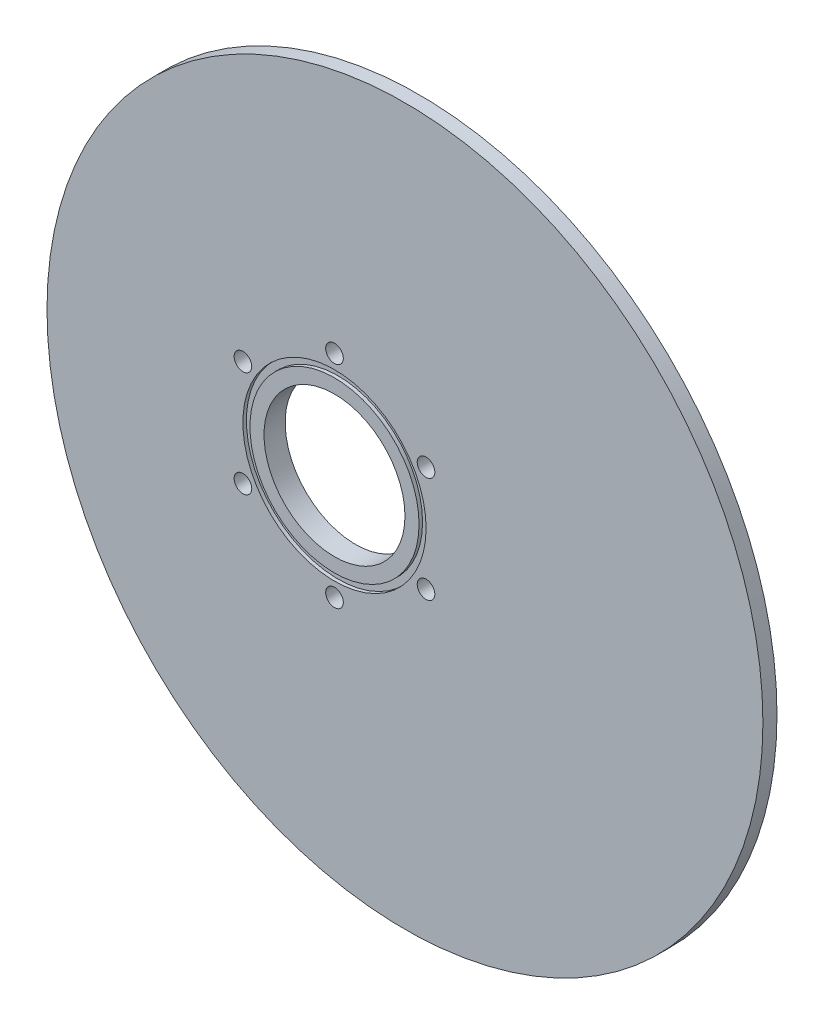
ISO-10303-21;
HEADER;
FILE_DESCRIPTION(('STEP AP214'),'2;1');
FILE_NAME('part.step','',(''),(''),'','','');
FILE_SCHEMA(('AUTOMOTIVE_DESIGN { 1 0 10303 214 1 1 1 1 }'));
ENDSEC;
DATA;
#1=APPLICATION_CONTEXT('core data for automotive mechanical design processes');
#2=APPLICATION_PROTOCOL_DEFINITION('international standard','automotive_design',2000,#1);
#3=PRODUCT_CONTEXT('',#1,'mechanical');
#4=PRODUCT('Part','Part','',(#3));
#5=PRODUCT_RELATED_PRODUCT_CATEGORY('part','',(#4));
#6=PRODUCT_DEFINITION_FORMATION('','',#4);
#7=PRODUCT_DEFINITION_CONTEXT('part definition',#1,'design');
#8=PRODUCT_DEFINITION('design','',#6,#7);
#9=PRODUCT_DEFINITION_SHAPE('','',#8);
#10=(LENGTH_UNIT() NAMED_UNIT(*) SI_UNIT(.MILLI.,.METRE.));
#11=(NAMED_UNIT(*) PLANE_ANGLE_UNIT() SI_UNIT($,.RADIAN.));
#12=(NAMED_UNIT(*) SI_UNIT($,.STERADIAN.) SOLID_ANGLE_UNIT());
#13=UNCERTAINTY_MEASURE_WITH_UNIT(LENGTH_MEASURE(1.E-05),#10,'distance_accuracy_value','');
#14=(GEOMETRIC_REPRESENTATION_CONTEXT(3) GLOBAL_UNCERTAINTY_ASSIGNED_CONTEXT((#13)) GLOBAL_UNIT_ASSIGNED_CONTEXT((#10,
#11,#12)) REPRESENTATION_CONTEXT('',''));
#15=CARTESIAN_POINT('',(0.,0.,0.));
#16=DIRECTION('',(0.,0.,1.));
#17=DIRECTION('',(1.,0.,0.));
#18=AXIS2_PLACEMENT_3D('',#15,#16,#17);
#19=CARTESIAN_POINT('',(0.,0.,0.));
#20=DIRECTION('',(0.,0.,1.));
#21=DIRECTION('',(1.,0.,0.));
#22=AXIS2_PLACEMENT_3D('',#19,#20,#21);
#23=PLANE('',#22);
#24=CARTESIAN_POINT('',(-20.,0.,0.));
#25=DIRECTION('',(0.,0.,1.));
#26=DIRECTION('',(1.,0.,0.));
#27=AXIS2_PLACEMENT_3D('',#24,#25,#26);
#28=CIRCLE('',#27,20.);
#29=CARTESIAN_POINT('',(0.,0.,0.));
#30=VERTEX_POINT('',#29);
#31=EDGE_CURVE('E51',#30,#30,#28,.T.);
#32=ORIENTED_EDGE('',*,*,#31,.F.);
#33=EDGE_LOOP('',(#32));
#34=FACE_BOUND('',#33,.T.);
#35=CARTESIAN_POINT('',(-20.,0.,0.));
#36=DIRECTION('',(0.,0.,1.));
#37=DIRECTION('',(1.,0.,0.));
#38=AXIS2_PLACEMENT_3D('',#35,#36,#37);
#39=CIRCLE('',#38,24.);
#40=CARTESIAN_POINT('',(4.,0.,0.));
#41=VERTEX_POINT('',#40);
#42=EDGE_CURVE('E99',#41,#41,#39,.T.);
#43=ORIENTED_EDGE('',*,*,#42,.T.);
#44=EDGE_LOOP('',(#43));
#45=FACE_BOUND('',#44,.T.);
#46=ADVANCED_FACE('F30',(#34,#45),#23,.T.);
#47=CARTESIAN_POINT('',(-20.,0.,0.));
#48=DIRECTION('',(0.,0.,1.));
#49=DIRECTION('',(1.,0.,0.));
#50=AXIS2_PLACEMENT_3D('',#47,#48,#49);
#51=CIRCLE('',#50,26.);
#52=CARTESIAN_POINT('',(6.,0.,0.));
#53=VERTEX_POINT('',#52);
#54=EDGE_CURVE('E93',#53,#53,#51,.T.);
#55=ORIENTED_EDGE('',*,*,#54,.F.);
#56=EDGE_LOOP('',(#55));
#57=FACE_BOUND('',#56,.T.);
#58=CARTESIAN_POINT('',(-45.980762113533,14.9999999999997,0.));
#59=DIRECTION('',(0.,0.,1.));
#60=DIRECTION('',(1.,0.,0.));
#61=AXIS2_PLACEMENT_3D('',#58,#59,#60);
#62=CIRCLE('',#61,2.49999999999999);
#63=CARTESIAN_POINT('',(-43.480762113533,14.9999999999997,0.));
#64=VERTEX_POINT('',#63);
#65=EDGE_CURVE('E87',#64,#64,#62,.T.);
#66=ORIENTED_EDGE('',*,*,#65,.F.);
#67=EDGE_LOOP('',(#66));
#68=FACE_BOUND('',#67,.T.);
#69=CARTESIAN_POINT('',(-45.9807621135326,-15.0000000000003,0.));
#70=DIRECTION('',(0.,0.,1.));
#71=DIRECTION('',(1.,0.,0.));
#72=AXIS2_PLACEMENT_3D('',#69,#70,#71);
#73=CIRCLE('',#72,2.49999999999999);
#74=CARTESIAN_POINT('',(-43.4807621135326,-15.0000000000003,0.));
#75=VERTEX_POINT('',#74);
#76=EDGE_CURVE('E81',#75,#75,#73,.T.);
#77=ORIENTED_EDGE('',*,*,#76,.F.);
#78=EDGE_LOOP('',(#77));
#79=FACE_BOUND('',#78,.T.);
#80=CARTESIAN_POINT('',(-19.9999999999993,-30.,0.));
#81=DIRECTION('',(0.,0.,1.));
#82=DIRECTION('',(1.,0.,0.));
#83=AXIS2_PLACEMENT_3D('',#80,#81,#82);
#84=CIRCLE('',#83,2.5);
#85=CARTESIAN_POINT('',(-17.4999999999993,-30.,0.));
#86=VERTEX_POINT('',#85);
#87=EDGE_CURVE('E75',#86,#86,#84,.T.);
#88=ORIENTED_EDGE('',*,*,#87,.F.);
#89=EDGE_LOOP('',(#88));
#90=FACE_BOUND('',#89,.T.);
#91=CARTESIAN_POINT('',(5.98076211353369,-14.9999999999997,0.));
#92=DIRECTION('',(0.,0.,1.));
#93=DIRECTION('',(1.,0.,0.));
#94=AXIS2_PLACEMENT_3D('',#91,#92,#93);
#95=CIRCLE('',#94,2.5);
#96=CARTESIAN_POINT('',(8.48076211353369,-14.9999999999997,0.));
#97=VERTEX_POINT('',#96);
#98=EDGE_CURVE('E69',#97,#97,#95,.T.);
#99=ORIENTED_EDGE('',*,*,#98,.F.);
#100=EDGE_LOOP('',(#99));
#101=FACE_BOUND('',#100,.T.);
#102=CARTESIAN_POINT('',(5.98076211353333,15.0000000000003,0.));
#103=DIRECTION('',(0.,0.,1.));
#104=DIRECTION('',(1.,0.,0.));
#105=AXIS2_PLACEMENT_3D('',#102,#103,#104);
#106=CIRCLE('',#105,2.5);
#107=CARTESIAN_POINT('',(8.48076211353333,15.0000000000003,0.));
#108=VERTEX_POINT('',#107);
#109=EDGE_CURVE('E63',#108,#108,#106,.T.);
#110=ORIENTED_EDGE('',*,*,#109,.F.);
#111=EDGE_LOOP('',(#110));
#112=FACE_BOUND('',#111,.T.);
#113=CARTESIAN_POINT('',(-20.,30.,0.));
#114=DIRECTION('',(0.,0.,1.));
#115=DIRECTION('',(1.,0.,0.));
#116=AXIS2_PLACEMENT_3D('',#113,#114,#115);
#117=CIRCLE('',#116,2.5);
#118=CARTESIAN_POINT('',(-17.5,30.,0.));
#119=VERTEX_POINT('',#118);
#120=EDGE_CURVE('E57',#119,#119,#117,.T.);
#121=ORIENTED_EDGE('',*,*,#120,.F.);
#122=EDGE_LOOP('',(#121));
#123=FACE_BOUND('',#122,.T.);
#124=CARTESIAN_POINT('',(0.,0.,0.));
#125=DIRECTION('',(0.,0.,-1.));
#126=DIRECTION('',(-1.,0.,0.));
#127=AXIS2_PLACEMENT_3D('',#124,#125,#126);
#128=CIRCLE('',#127,101.6);
#129=CARTESIAN_POINT('',(-101.6,0.,0.));
#130=VERTEX_POINT('',#129);
#131=EDGE_CURVE('E10',#130,#130,#128,.T.);
#132=ORIENTED_EDGE('',*,*,#131,.F.);
#133=EDGE_LOOP('',(#132));
#134=FACE_BOUND('',#133,.T.);
#135=ADVANCED_FACE('F32',(#57,#68,#79,#90,#101,#112,#123,#134),#23,.T.);
#136=CARTESIAN_POINT('',(0.,0.,-6.00000000000001));
#137=DIRECTION('',(0.,0.,-1.));
#138=DIRECTION('',(-1.,0.,0.));
#139=AXIS2_PLACEMENT_3D('',#136,#137,#138);
#140=CYLINDRICAL_SURFACE('',#139,101.6);
#141=ORIENTED_EDGE('',*,*,#131,.T.);
#142=EDGE_LOOP('',(#141));
#143=FACE_BOUND('',#142,.T.);
#144=CARTESIAN_POINT('',(0.,0.,-4.));
#145=DIRECTION('',(0.,0.,-1.));
#146=DIRECTION('',(-1.,0.,0.));
#147=AXIS2_PLACEMENT_3D('',#144,#145,#146);
#148=CIRCLE('',#147,101.6);
#149=CARTESIAN_POINT('',(-101.6,0.,-4.));
#150=VERTEX_POINT('',#149);
#151=EDGE_CURVE('E37',#150,#150,#148,.T.);
#152=ORIENTED_EDGE('',*,*,#151,.F.);
#153=EDGE_LOOP('',(#152));
#154=FACE_BOUND('',#153,.T.);
#155=ADVANCED_FACE('F123',(#143,#154),#140,.T.);
#156=CARTESIAN_POINT('',(0.,101.6,-4.));
#157=DIRECTION('',(0.,0.,-1.));
#158=DIRECTION('',(-1.,0.,0.));
#159=AXIS2_PLACEMENT_3D('',#156,#157,#158);
#160=PLANE('',#159);
#161=ORIENTED_EDGE('',*,*,#151,.T.);
#162=EDGE_LOOP('',(#161));
#163=FACE_BOUND('',#162,.T.);
#164=CARTESIAN_POINT('',(0.,0.,-4.));
#165=DIRECTION('',(0.,0.,-1.));
#166=DIRECTION('',(-1.,0.,0.));
#167=AXIS2_PLACEMENT_3D('',#164,#165,#166);
#168=CIRCLE('',#167,95.25);
#169=CARTESIAN_POINT('',(-95.25,0.,-4.));
#170=VERTEX_POINT('',#169);
#171=EDGE_CURVE('E41',#170,#170,#168,.T.);
#172=ORIENTED_EDGE('',*,*,#171,.F.);
#173=EDGE_LOOP('',(#172));
#174=FACE_BOUND('',#173,.T.);
#175=ADVANCED_FACE('F197',(#163,#174),#160,.T.);
#176=CARTESIAN_POINT('',(0.,0.,-6.00000000000001));
#177=DIRECTION('',(0.,0.,-1.));
#178=DIRECTION('',(-1.,0.,0.));
#179=AXIS2_PLACEMENT_3D('',#176,#177,#178);
#180=CYLINDRICAL_SURFACE('',#179,95.25);
#181=ORIENTED_EDGE('',*,*,#171,.T.);
#182=EDGE_LOOP('',(#181));
#183=FACE_BOUND('',#182,.T.);
#184=CARTESIAN_POINT('',(0.,0.,-6.));
#185=DIRECTION('',(0.,0.,-1.));
#186=DIRECTION('',(-1.,0.,0.));
#187=AXIS2_PLACEMENT_3D('',#184,#185,#186);
#188=CIRCLE('',#187,95.25);
#189=CARTESIAN_POINT('',(-95.25,0.,-6.));
#190=VERTEX_POINT('',#189);
#191=EDGE_CURVE('E45',#190,#190,#188,.T.);
#192=ORIENTED_EDGE('',*,*,#191,.F.);
#193=EDGE_LOOP('',(#192));
#194=FACE_BOUND('',#193,.T.);
#195=ADVANCED_FACE('F186',(#183,#194),#180,.T.);
#196=CARTESIAN_POINT('',(0.,95.25,-6.00000000000001));
#197=DIRECTION('',(0.,0.,-1.));
#198=DIRECTION('',(-1.,0.,0.));
#199=AXIS2_PLACEMENT_3D('',#196,#197,#198);
#200=PLANE('',#199);
#201=CARTESIAN_POINT('',(-45.980762113533,14.9999999999997,-6.));
#202=DIRECTION('',(0.,0.,1.));
#203=DIRECTION('',(1.,0.,0.));
#204=AXIS2_PLACEMENT_3D('',#201,#202,#203);
#205=CIRCLE('',#204,2.49999999999999);
#206=CARTESIAN_POINT('',(-43.480762113533,14.9999999999997,-6.));
#207=VERTEX_POINT('',#206);
#208=EDGE_CURVE('E84',#207,#207,#205,.T.);
#209=ORIENTED_EDGE('',*,*,#208,.T.);
#210=EDGE_LOOP('',(#209));
#211=FACE_BOUND('',#210,.T.);
#212=CARTESIAN_POINT('',(-45.9807621135326,-15.0000000000003,-6.));
#213=DIRECTION('',(0.,0.,1.));
#214=DIRECTION('',(1.,0.,0.));
#215=AXIS2_PLACEMENT_3D('',#212,#213,#214);
#216=CIRCLE('',#215,2.49999999999999);
#217=CARTESIAN_POINT('',(-43.4807621135326,-15.0000000000003,-6.));
#218=VERTEX_POINT('',#217);
#219=EDGE_CURVE('E78',#218,#218,#216,.T.);
#220=ORIENTED_EDGE('',*,*,#219,.T.);
#221=EDGE_LOOP('',(#220));
#222=FACE_BOUND('',#221,.T.);
#223=CARTESIAN_POINT('',(-19.9999999999993,-30.,-6.));
#224=DIRECTION('',(0.,0.,1.));
#225=DIRECTION('',(1.,0.,0.));
#226=AXIS2_PLACEMENT_3D('',#223,#224,#225);
#227=CIRCLE('',#226,2.5);
#228=CARTESIAN_POINT('',(-17.4999999999993,-30.,-6.));
#229=VERTEX_POINT('',#228);
#230=EDGE_CURVE('E72',#229,#229,#227,.T.);
#231=ORIENTED_EDGE('',*,*,#230,.T.);
#232=EDGE_LOOP('',(#231));
#233=FACE_BOUND('',#232,.T.);
#234=CARTESIAN_POINT('',(5.98076211353369,-14.9999999999997,-6.));
#235=DIRECTION('',(0.,0.,1.));
#236=DIRECTION('',(1.,0.,0.));
#237=AXIS2_PLACEMENT_3D('',#234,#235,#236);
#238=CIRCLE('',#237,2.5);
#239=CARTESIAN_POINT('',(8.48076211353369,-14.9999999999997,-6.));
#240=VERTEX_POINT('',#239);
#241=EDGE_CURVE('E66',#240,#240,#238,.T.);
#242=ORIENTED_EDGE('',*,*,#241,.T.);
#243=EDGE_LOOP('',(#242));
#244=FACE_BOUND('',#243,.T.);
#245=CARTESIAN_POINT('',(5.98076211353333,15.0000000000003,-6.));
#246=DIRECTION('',(0.,0.,1.));
#247=DIRECTION('',(1.,0.,0.));
#248=AXIS2_PLACEMENT_3D('',#245,#246,#247);
#249=CIRCLE('',#248,2.5);
#250=CARTESIAN_POINT('',(8.48076211353333,15.0000000000003,-6.));
#251=VERTEX_POINT('',#250);
#252=EDGE_CURVE('E60',#251,#251,#249,.T.);
#253=ORIENTED_EDGE('',*,*,#252,.T.);
#254=EDGE_LOOP('',(#253));
#255=FACE_BOUND('',#254,.T.);
#256=CARTESIAN_POINT('',(-20.,30.,-6.));
#257=DIRECTION('',(0.,0.,1.));
#258=DIRECTION('',(1.,0.,0.));
#259=AXIS2_PLACEMENT_3D('',#256,#257,#258);
#260=CIRCLE('',#259,2.5);
#261=CARTESIAN_POINT('',(-17.5,30.,-6.));
#262=VERTEX_POINT('',#261);
#263=EDGE_CURVE('E54',#262,#262,#260,.T.);
#264=ORIENTED_EDGE('',*,*,#263,.T.);
#265=EDGE_LOOP('',(#264));
#266=FACE_BOUND('',#265,.T.);
#267=CARTESIAN_POINT('',(-20.,0.,-6.));
#268=DIRECTION('',(0.,0.,1.));
#269=DIRECTION('',(1.,0.,0.));
#270=AXIS2_PLACEMENT_3D('',#267,#268,#269);
#271=CIRCLE('',#270,20.);
#272=CARTESIAN_POINT('',(0.,0.,-6.));
#273=VERTEX_POINT('',#272);
#274=EDGE_CURVE('E50',#273,#273,#271,.T.);
#275=ORIENTED_EDGE('',*,*,#274,.T.);
#276=EDGE_LOOP('',(#275));
#277=FACE_BOUND('',#276,.T.);
#278=ORIENTED_EDGE('',*,*,#191,.T.);
#279=EDGE_LOOP('',(#278));
#280=FACE_BOUND('',#279,.T.);
#281=ADVANCED_FACE('F150',(#211,#222,#233,#244,#255,#266,#277,#280),#200,.T.);
#282=CARTESIAN_POINT('',(-20.,0.,-6.));
#283=DIRECTION('',(0.,0.,1.));
#284=DIRECTION('',(1.,0.,0.));
#285=AXIS2_PLACEMENT_3D('',#282,#283,#284);
#286=CYLINDRICAL_SURFACE('',#285,20.);
#287=ORIENTED_EDGE('',*,*,#274,.F.);
#288=EDGE_LOOP('',(#287));
#289=FACE_BOUND('',#288,.T.);
#290=ORIENTED_EDGE('',*,*,#31,.T.);
#291=EDGE_LOOP('',(#290));
#292=FACE_BOUND('',#291,.T.);
#293=ADVANCED_FACE('F140',(#289,#292),#286,.F.);
#294=CARTESIAN_POINT('',(-20.,30.,-6.));
#295=DIRECTION('',(0.,0.,1.));
#296=DIRECTION('',(1.,0.,0.));
#297=AXIS2_PLACEMENT_3D('',#294,#295,#296);
#298=CYLINDRICAL_SURFACE('',#297,2.5);
#299=ORIENTED_EDGE('',*,*,#263,.F.);
#300=EDGE_LOOP('',(#299));
#301=FACE_BOUND('',#300,.T.);
#302=ORIENTED_EDGE('',*,*,#120,.T.);
#303=EDGE_LOOP('',(#302));
#304=FACE_BOUND('',#303,.T.);
#305=ADVANCED_FACE('F137',(#301,#304),#298,.F.);
#306=CARTESIAN_POINT('',(5.98076211353333,15.0000000000003,-6.));
#307=DIRECTION('',(0.,0.,1.));
#308=DIRECTION('',(1.,0.,0.));
#309=AXIS2_PLACEMENT_3D('',#306,#307,#308);
#310=CYLINDRICAL_SURFACE('',#309,2.5);
#311=ORIENTED_EDGE('',*,*,#252,.F.);
#312=EDGE_LOOP('',(#311));
#313=FACE_BOUND('',#312,.T.);
#314=ORIENTED_EDGE('',*,*,#109,.T.);
#315=EDGE_LOOP('',(#314));
#316=FACE_BOUND('',#315,.T.);
#317=ADVANCED_FACE('F139',(#313,#316),#310,.F.);
#318=CARTESIAN_POINT('',(5.98076211353369,-14.9999999999997,-6.));
#319=DIRECTION('',(0.,0.,1.));
#320=DIRECTION('',(1.,0.,0.));
#321=AXIS2_PLACEMENT_3D('',#318,#319,#320);
#322=CYLINDRICAL_SURFACE('',#321,2.5);
#323=ORIENTED_EDGE('',*,*,#241,.F.);
#324=EDGE_LOOP('',(#323));
#325=FACE_BOUND('',#324,.T.);
#326=ORIENTED_EDGE('',*,*,#98,.T.);
#327=EDGE_LOOP('',(#326));
#328=FACE_BOUND('',#327,.T.);
#329=ADVANCED_FACE('F147',(#325,#328),#322,.F.);
#330=CARTESIAN_POINT('',(-19.9999999999993,-30.,-6.));
#331=DIRECTION('',(0.,0.,1.));
#332=DIRECTION('',(1.,0.,0.));
#333=AXIS2_PLACEMENT_3D('',#330,#331,#332);
#334=CYLINDRICAL_SURFACE('',#333,2.5);
#335=ORIENTED_EDGE('',*,*,#230,.F.);
#336=EDGE_LOOP('',(#335));
#337=FACE_BOUND('',#336,.T.);
#338=ORIENTED_EDGE('',*,*,#87,.T.);
#339=EDGE_LOOP('',(#338));
#340=FACE_BOUND('',#339,.T.);
#341=ADVANCED_FACE('F172',(#337,#340),#334,.F.);
#342=CARTESIAN_POINT('',(-45.9807621135326,-15.0000000000003,-6.));
#343=DIRECTION('',(0.,0.,1.));
#344=DIRECTION('',(1.,0.,0.));
#345=AXIS2_PLACEMENT_3D('',#342,#343,#344);
#346=CYLINDRICAL_SURFACE('',#345,2.49999999999999);
#347=ORIENTED_EDGE('',*,*,#219,.F.);
#348=EDGE_LOOP('',(#347));
#349=FACE_BOUND('',#348,.T.);
#350=ORIENTED_EDGE('',*,*,#76,.T.);
#351=EDGE_LOOP('',(#350));
#352=FACE_BOUND('',#351,.T.);
#353=ADVANCED_FACE('F168',(#349,#352),#346,.F.);
#354=CARTESIAN_POINT('',(-45.980762113533,14.9999999999997,-6.));
#355=DIRECTION('',(0.,0.,1.));
#356=DIRECTION('',(1.,0.,0.));
#357=AXIS2_PLACEMENT_3D('',#354,#355,#356);
#358=CYLINDRICAL_SURFACE('',#357,2.49999999999999);
#359=ORIENTED_EDGE('',*,*,#208,.F.);
#360=EDGE_LOOP('',(#359));
#361=FACE_BOUND('',#360,.T.);
#362=ORIENTED_EDGE('',*,*,#65,.T.);
#363=EDGE_LOOP('',(#362));
#364=FACE_BOUND('',#363,.T.);
#365=ADVANCED_FACE('F117',(#361,#364),#358,.F.);
#366=CARTESIAN_POINT('',(-20.,0.,-1.));
#367=DIRECTION('',(0.,0.,1.));
#368=DIRECTION('',(1.,0.,0.));
#369=AXIS2_PLACEMENT_3D('',#366,#367,#368);
#370=CYLINDRICAL_SURFACE('',#369,26.);
#371=CARTESIAN_POINT('',(-20.,0.,-1.));
#372=DIRECTION('',(0.,0.,1.));
#373=DIRECTION('',(1.,0.,0.));
#374=AXIS2_PLACEMENT_3D('',#371,#372,#373);
#375=CIRCLE('',#374,26.);
#376=CARTESIAN_POINT('',(6.,0.,-1.));
#377=VERTEX_POINT('',#376);
#378=EDGE_CURVE('E90',#377,#377,#375,.T.);
#379=ORIENTED_EDGE('',*,*,#378,.F.);
#380=EDGE_LOOP('',(#379));
#381=FACE_BOUND('',#380,.T.);
#382=ORIENTED_EDGE('',*,*,#54,.T.);
#383=EDGE_LOOP('',(#382));
#384=FACE_BOUND('',#383,.T.);
#385=ADVANCED_FACE('F111',(#381,#384),#370,.F.);
#386=CARTESIAN_POINT('',(-20.,0.,-1.));
#387=DIRECTION('',(0.,0.,1.));
#388=DIRECTION('',(1.,0.,0.));
#389=AXIS2_PLACEMENT_3D('',#386,#387,#388);
#390=PLANE('',#389);
#391=CARTESIAN_POINT('',(-20.,0.,-1.));
#392=DIRECTION('',(0.,0.,1.));
#393=DIRECTION('',(1.,0.,0.));
#394=AXIS2_PLACEMENT_3D('',#391,#392,#393);
#395=CIRCLE('',#394,24.);
#396=CARTESIAN_POINT('',(4.,0.,-1.));
#397=VERTEX_POINT('',#396);
#398=EDGE_CURVE('E96',#397,#397,#395,.T.);
#399=ORIENTED_EDGE('',*,*,#398,.F.);
#400=EDGE_LOOP('',(#399));
#401=FACE_BOUND('',#400,.T.);
#402=ORIENTED_EDGE('',*,*,#378,.T.);
#403=EDGE_LOOP('',(#402));
#404=FACE_BOUND('',#403,.T.);
#405=ADVANCED_FACE('F108',(#401,#404),#390,.T.);
#406=CARTESIAN_POINT('',(-20.,0.,-1.));
#407=DIRECTION('',(0.,0.,1.));
#408=DIRECTION('',(1.,0.,0.));
#409=AXIS2_PLACEMENT_3D('',#406,#407,#408);
#410=CYLINDRICAL_SURFACE('',#409,24.);
#411=ORIENTED_EDGE('',*,*,#398,.T.);
#412=EDGE_LOOP('',(#411));
#413=FACE_BOUND('',#412,.T.);
#414=ORIENTED_EDGE('',*,*,#42,.F.);
#415=EDGE_LOOP('',(#414));
#416=FACE_BOUND('',#415,.T.);
#417=ADVANCED_FACE('F105',(#413,#416),#410,.T.);
#418=CLOSED_SHELL('',(#46,#135,#155,#175,#195,#281,#293,#305,#317,#329,#341,#353,#365,#385,#405,#417));
#419=MANIFOLD_SOLID_BREP('B2',#418);
#420=ADVANCED_BREP_SHAPE_REPRESENTATION('',(#18,#419),#14);
#421=SHAPE_DEFINITION_REPRESENTATION(#9,#420);
ENDSEC;
END-ISO-10303-21;
